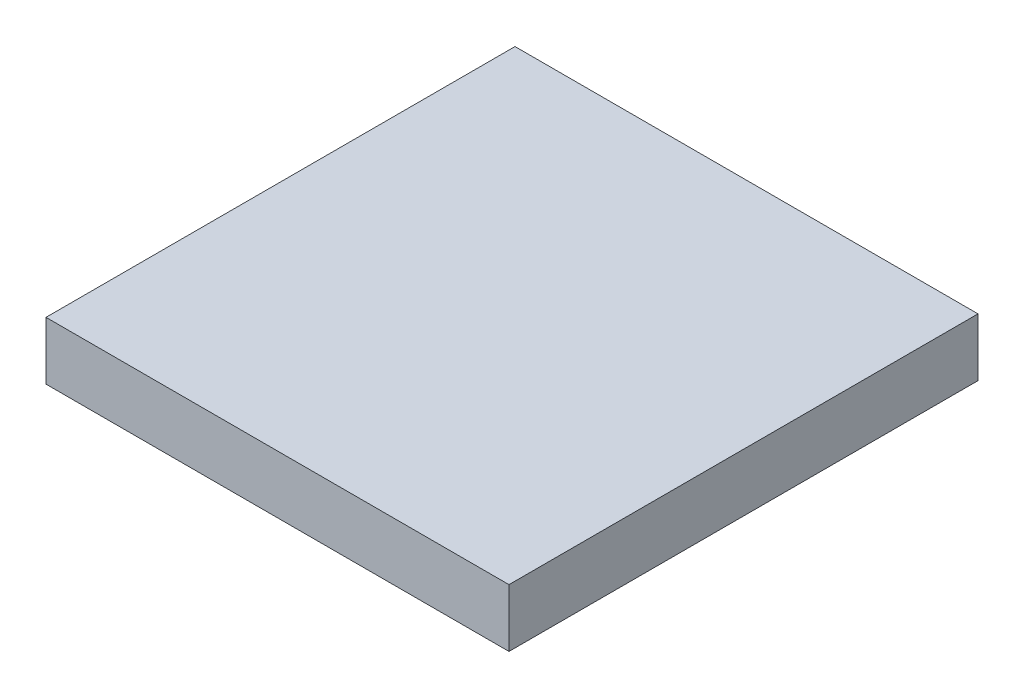
ISO-10303-21;
HEADER;
FILE_DESCRIPTION(('STEP AP214'),'2;1');
FILE_NAME('part.step','',(''),(''),'','','');
FILE_SCHEMA(('AUTOMOTIVE_DESIGN { 1 0 10303 214 1 1 1 1 }'));
ENDSEC;
DATA;
#1=APPLICATION_CONTEXT('core data for automotive mechanical design processes');
#2=APPLICATION_PROTOCOL_DEFINITION('international standard','automotive_design',2000,#1);
#3=PRODUCT_CONTEXT('',#1,'mechanical');
#4=PRODUCT('Part','Part','',(#3));
#5=PRODUCT_RELATED_PRODUCT_CATEGORY('part','',(#4));
#6=PRODUCT_DEFINITION_FORMATION('','',#4);
#7=PRODUCT_DEFINITION_CONTEXT('part definition',#1,'design');
#8=PRODUCT_DEFINITION('design','',#6,#7);
#9=PRODUCT_DEFINITION_SHAPE('','',#8);
#10=(LENGTH_UNIT() NAMED_UNIT(*) SI_UNIT(.MILLI.,.METRE.));
#11=(NAMED_UNIT(*) PLANE_ANGLE_UNIT() SI_UNIT($,.RADIAN.));
#12=(NAMED_UNIT(*) SI_UNIT($,.STERADIAN.) SOLID_ANGLE_UNIT());
#13=UNCERTAINTY_MEASURE_WITH_UNIT(LENGTH_MEASURE(1.E-05),#10,'distance_accuracy_value','');
#14=(GEOMETRIC_REPRESENTATION_CONTEXT(3) GLOBAL_UNCERTAINTY_ASSIGNED_CONTEXT((#13)) GLOBAL_UNIT_ASSIGNED_CONTEXT((#10,
#11,#12)) REPRESENTATION_CONTEXT('',''));
#15=CARTESIAN_POINT('',(0.,0.,0.));
#16=DIRECTION('',(0.,0.,1.));
#17=DIRECTION('',(1.,0.,0.));
#18=AXIS2_PLACEMENT_3D('',#15,#16,#17);
#19=CARTESIAN_POINT('',(12.7,3.175,-12.8656521739131));
#20=DIRECTION('',(-1.,0.,0.));
#21=DIRECTION('',(0.,0.,1.));
#22=AXIS2_PLACEMENT_3D('',#19,#20,#21);
#23=PLANE('',#22);
#24=DIRECTION('',(0.,0.,-1.));
#25=VECTOR('',#24,1.);
#26=CARTESIAN_POINT('',(12.7,0.,-12.8656521739131));
#27=LINE('',#26,#25);
#28=CARTESIAN_POINT('',(12.7,0.,12.865652173913));
#29=VERTEX_POINT('',#28);
#30=CARTESIAN_POINT('',(12.7,0.,-12.8656521739131));
#31=VERTEX_POINT('',#30);
#32=EDGE_CURVE('E107',#29,#31,#27,.T.);
#33=ORIENTED_EDGE('',*,*,#32,.T.);
#34=DIRECTION('',(0.,-1.,0.));
#35=VECTOR('',#34,1.);
#36=CARTESIAN_POINT('',(12.7,3.175,-12.8656521739131));
#37=LINE('',#36,#35);
#38=CARTESIAN_POINT('',(12.7,3.175,-12.8656521739131));
#39=VERTEX_POINT('',#38);
#40=EDGE_CURVE('E11',#39,#31,#37,.T.);
#41=ORIENTED_EDGE('',*,*,#40,.F.);
#42=DIRECTION('',(0.,0.,-1.));
#43=VECTOR('',#42,1.);
#44=CARTESIAN_POINT('',(12.7,3.175,-12.8656521739131));
#45=LINE('',#44,#43);
#46=CARTESIAN_POINT('',(12.7,3.175,12.865652173913));
#47=VERTEX_POINT('',#46);
#48=EDGE_CURVE('E91',#47,#39,#45,.T.);
#49=ORIENTED_EDGE('',*,*,#48,.F.);
#50=DIRECTION('',(0.,-1.,0.));
#51=VECTOR('',#50,1.);
#52=CARTESIAN_POINT('',(12.7,3.175,12.865652173913));
#53=LINE('',#52,#51);
#54=EDGE_CURVE('E103',#47,#29,#53,.T.);
#55=ORIENTED_EDGE('',*,*,#54,.T.);
#56=EDGE_LOOP('',(#33,#41,#49,#55));
#57=FACE_BOUND('',#56,.T.);
#58=ADVANCED_FACE('F39',(#57),#23,.F.);
#59=CARTESIAN_POINT('',(-12.7,3.175,-12.8656521739131));
#60=DIRECTION('',(0.,0.,1.));
#61=DIRECTION('',(1.,0.,0.));
#62=AXIS2_PLACEMENT_3D('',#59,#60,#61);
#63=PLANE('',#62);
#64=DIRECTION('',(-1.,0.,0.));
#65=VECTOR('',#64,1.);
#66=CARTESIAN_POINT('',(-12.7,0.,-12.8656521739131));
#67=LINE('',#66,#65);
#68=CARTESIAN_POINT('',(-12.7,0.,-12.8656521739131));
#69=VERTEX_POINT('',#68);
#70=EDGE_CURVE('E96',#31,#69,#67,.T.);
#71=ORIENTED_EDGE('',*,*,#70,.T.);
#72=DIRECTION('',(0.,-1.,0.));
#73=VECTOR('',#72,1.);
#74=CARTESIAN_POINT('',(-12.7,3.175,-12.8656521739131));
#75=LINE('',#74,#73);
#76=CARTESIAN_POINT('',(-12.7,3.175,-12.8656521739131));
#77=VERTEX_POINT('',#76);
#78=EDGE_CURVE('E48',#77,#69,#75,.T.);
#79=ORIENTED_EDGE('',*,*,#78,.F.);
#80=DIRECTION('',(-1.,0.,0.));
#81=VECTOR('',#80,1.);
#82=CARTESIAN_POINT('',(-12.7,3.175,-12.8656521739131));
#83=LINE('',#82,#81);
#84=EDGE_CURVE('E86',#39,#77,#83,.T.);
#85=ORIENTED_EDGE('',*,*,#84,.F.);
#86=ORIENTED_EDGE('',*,*,#40,.T.);
#87=EDGE_LOOP('',(#71,#79,#85,#86));
#88=FACE_BOUND('',#87,.T.);
#89=ADVANCED_FACE('F95',(#88),#63,.F.);
#90=CARTESIAN_POINT('',(-12.7,3.175,-12.8656521739131));
#91=DIRECTION('',(1.,0.,0.));
#92=DIRECTION('',(0.,0.,-1.));
#93=AXIS2_PLACEMENT_3D('',#90,#91,#92);
#94=PLANE('',#93);
#95=DIRECTION('',(0.,0.,1.));
#96=VECTOR('',#95,1.);
#97=CARTESIAN_POINT('',(-12.7,0.,-12.8656521739131));
#98=LINE('',#97,#96);
#99=CARTESIAN_POINT('',(-12.7,0.,12.865652173913));
#100=VERTEX_POINT('',#99);
#101=EDGE_CURVE('E73',#69,#100,#98,.T.);
#102=ORIENTED_EDGE('',*,*,#101,.T.);
#103=DIRECTION('',(0.,-1.,0.));
#104=VECTOR('',#103,1.);
#105=CARTESIAN_POINT('',(-12.7,3.175,12.865652173913));
#106=LINE('',#105,#104);
#107=CARTESIAN_POINT('',(-12.7,3.175,12.865652173913));
#108=VERTEX_POINT('',#107);
#109=EDGE_CURVE('E98',#108,#100,#106,.T.);
#110=ORIENTED_EDGE('',*,*,#109,.F.);
#111=DIRECTION('',(0.,0.,1.));
#112=VECTOR('',#111,1.);
#113=CARTESIAN_POINT('',(-12.7,3.175,-12.8656521739131));
#114=LINE('',#113,#112);
#115=EDGE_CURVE('E89',#77,#108,#114,.T.);
#116=ORIENTED_EDGE('',*,*,#115,.F.);
#117=ORIENTED_EDGE('',*,*,#78,.T.);
#118=EDGE_LOOP('',(#102,#110,#116,#117));
#119=FACE_BOUND('',#118,.T.);
#120=ADVANCED_FACE('F99',(#119),#94,.F.);
#121=CARTESIAN_POINT('',(-12.7,3.175,12.865652173913));
#122=DIRECTION('',(0.,0.,-1.));
#123=DIRECTION('',(-1.,0.,0.));
#124=AXIS2_PLACEMENT_3D('',#121,#122,#123);
#125=PLANE('',#124);
#126=DIRECTION('',(1.,0.,0.));
#127=VECTOR('',#126,1.);
#128=CARTESIAN_POINT('',(-12.7,0.,12.865652173913));
#129=LINE('',#128,#127);
#130=EDGE_CURVE('E79',#100,#29,#129,.T.);
#131=ORIENTED_EDGE('',*,*,#130,.T.);
#132=ORIENTED_EDGE('',*,*,#54,.F.);
#133=DIRECTION('',(1.,0.,0.));
#134=VECTOR('',#133,1.);
#135=CARTESIAN_POINT('',(-12.7,3.175,12.865652173913));
#136=LINE('',#135,#134);
#137=EDGE_CURVE('E56',#108,#47,#136,.T.);
#138=ORIENTED_EDGE('',*,*,#137,.F.);
#139=ORIENTED_EDGE('',*,*,#109,.T.);
#140=EDGE_LOOP('',(#131,#132,#138,#139));
#141=FACE_BOUND('',#140,.T.);
#142=ADVANCED_FACE('F120',(#141),#125,.F.);
#143=CARTESIAN_POINT('',(0.,3.175,0.));
#144=DIRECTION('',(0.,1.,0.));
#145=DIRECTION('',(0.,0.,1.));
#146=AXIS2_PLACEMENT_3D('',#143,#144,#145);
#147=PLANE('',#146);
#148=ORIENTED_EDGE('',*,*,#48,.T.);
#149=ORIENTED_EDGE('',*,*,#84,.T.);
#150=ORIENTED_EDGE('',*,*,#115,.T.);
#151=ORIENTED_EDGE('',*,*,#137,.T.);
#152=EDGE_LOOP('',(#148,#149,#150,#151));
#153=FACE_BOUND('',#152,.T.);
#154=ADVANCED_FACE('F87',(#153),#147,.T.);
#155=CARTESIAN_POINT('',(0.,0.,0.));
#156=DIRECTION('',(0.,1.,0.));
#157=DIRECTION('',(0.,0.,1.));
#158=AXIS2_PLACEMENT_3D('',#155,#156,#157);
#159=PLANE('',#158);
#160=ORIENTED_EDGE('',*,*,#32,.F.);
#161=ORIENTED_EDGE('',*,*,#130,.F.);
#162=ORIENTED_EDGE('',*,*,#101,.F.);
#163=ORIENTED_EDGE('',*,*,#70,.F.);
#164=EDGE_LOOP('',(#160,#161,#162,#163));
#165=FACE_BOUND('',#164,.T.);
#166=ADVANCED_FACE('F123',(#165),#159,.F.);
#167=CLOSED_SHELL('',(#58,#89,#120,#142,#154,#166));
#168=MANIFOLD_SOLID_BREP('B2',#167);
#169=ADVANCED_BREP_SHAPE_REPRESENTATION('',(#18,#168),#14);
#170=SHAPE_DEFINITION_REPRESENTATION(#9,#169);
ENDSEC;
END-ISO-10303-21;
